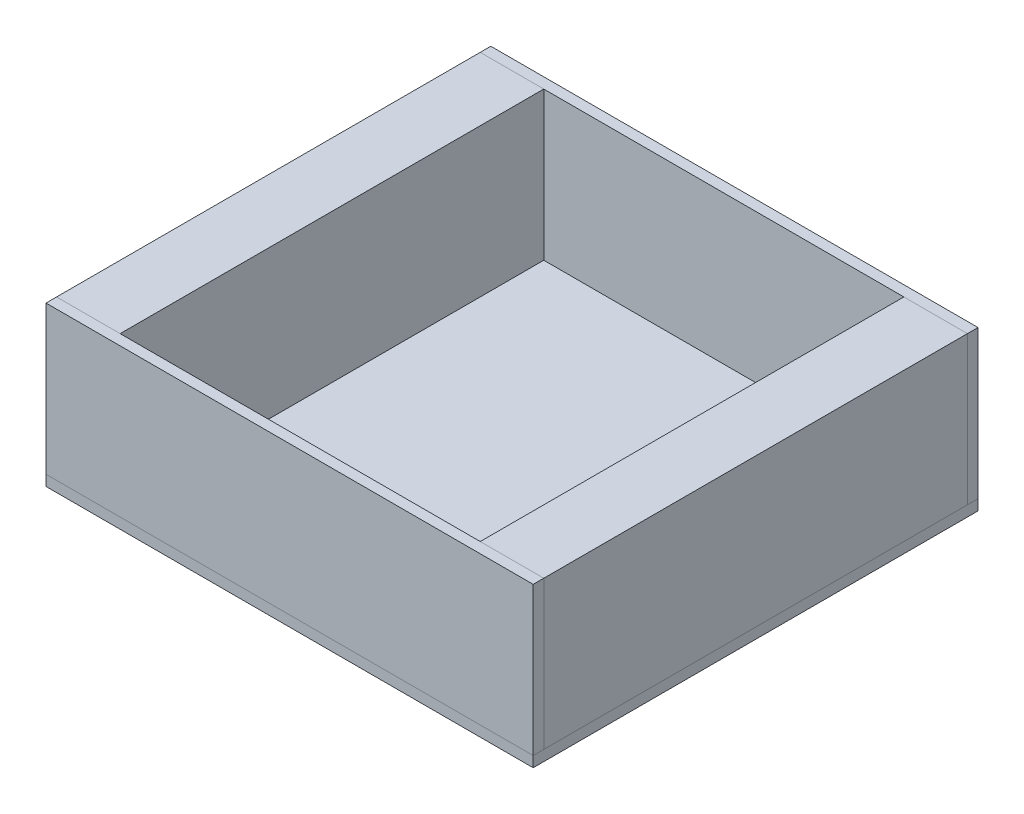
ISO-10303-21;
HEADER;
FILE_DESCRIPTION(('STEP AP214'),'2;1');
FILE_NAME('part.step','',(''),(''),'','','');
FILE_SCHEMA(('AUTOMOTIVE_DESIGN { 1 0 10303 214 1 1 1 1 }'));
ENDSEC;
DATA;
#1=APPLICATION_CONTEXT('core data for automotive mechanical design processes');
#2=APPLICATION_PROTOCOL_DEFINITION('international standard','automotive_design',2000,#1);
#3=PRODUCT_CONTEXT('',#1,'mechanical');
#4=PRODUCT('Part','Part','',(#3));
#5=PRODUCT_RELATED_PRODUCT_CATEGORY('part','',(#4));
#6=PRODUCT_DEFINITION_FORMATION('','',#4);
#7=PRODUCT_DEFINITION_CONTEXT('part definition',#1,'design');
#8=PRODUCT_DEFINITION('design','',#6,#7);
#9=PRODUCT_DEFINITION_SHAPE('','',#8);
#10=(LENGTH_UNIT() NAMED_UNIT(*) SI_UNIT(.MILLI.,.METRE.));
#11=(NAMED_UNIT(*) PLANE_ANGLE_UNIT() SI_UNIT($,.RADIAN.));
#12=(NAMED_UNIT(*) SI_UNIT($,.STERADIAN.) SOLID_ANGLE_UNIT());
#13=UNCERTAINTY_MEASURE_WITH_UNIT(LENGTH_MEASURE(1.E-05),#10,'distance_accuracy_value','');
#14=(GEOMETRIC_REPRESENTATION_CONTEXT(3) GLOBAL_UNCERTAINTY_ASSIGNED_CONTEXT((#13)) GLOBAL_UNIT_ASSIGNED_CONTEXT((#10,
#11,#12)) REPRESENTATION_CONTEXT('',''));
#15=CARTESIAN_POINT('',(0.,0.,0.));
#16=DIRECTION('',(0.,0.,1.));
#17=DIRECTION('',(1.,0.,0.));
#18=AXIS2_PLACEMENT_3D('',#15,#16,#17);
#19=CARTESIAN_POINT('',(-19.05,-50.8,-6.35000000000002));
#20=DIRECTION('',(0.,0.,-1.));
#21=DIRECTION('',(-1.,0.,0.));
#22=AXIS2_PLACEMENT_3D('',#19,#20,#21);
#23=PLANE('',#22);
#24=DIRECTION('',(-1.,0.,0.));
#25=VECTOR('',#24,1.);
#26=CARTESIAN_POINT('',(-19.05,-44.45,-6.35000000000002));
#27=LINE('',#26,#25);
#28=CARTESIAN_POINT('',(273.05,-44.45,-6.35000000000002));
#29=VERTEX_POINT('',#28);
#30=CARTESIAN_POINT('',(-19.05,-44.45,-6.35000000000002));
#31=VERTEX_POINT('',#30);
#32=EDGE_CURVE('E117',#29,#31,#27,.T.);
#33=ORIENTED_EDGE('',*,*,#32,.F.);
#34=DIRECTION('',(0.,1.,0.));
#35=VECTOR('',#34,1.);
#36=CARTESIAN_POINT('',(273.05,-50.8,-6.35000000000002));
#37=LINE('',#36,#35);
#38=CARTESIAN_POINT('',(273.05,-50.8,-6.35000000000002));
#39=VERTEX_POINT('',#38);
#40=EDGE_CURVE('E12',#39,#29,#37,.T.);
#41=ORIENTED_EDGE('',*,*,#40,.F.);
#42=DIRECTION('',(-1.,0.,0.));
#43=VECTOR('',#42,1.);
#44=CARTESIAN_POINT('',(-19.05,-50.8,-6.35000000000002));
#45=LINE('',#44,#43);
#46=CARTESIAN_POINT('',(-19.05,-50.8,-6.35000000000002));
#47=VERTEX_POINT('',#46);
#48=EDGE_CURVE('E111',#39,#47,#45,.T.);
#49=ORIENTED_EDGE('',*,*,#48,.T.);
#50=DIRECTION('',(0.,1.,0.));
#51=VECTOR('',#50,1.);
#52=CARTESIAN_POINT('',(-19.05,-50.8,-6.35000000000002));
#53=LINE('',#52,#51);
#54=EDGE_CURVE('E56',#47,#31,#53,.T.);
#55=ORIENTED_EDGE('',*,*,#54,.T.);
#56=EDGE_LOOP('',(#33,#41,#49,#55));
#57=FACE_BOUND('',#56,.T.);
#58=ADVANCED_FACE('F53',(#57),#23,.T.);
#59=CARTESIAN_POINT('',(273.05,-50.8,254.));
#60=DIRECTION('',(1.,0.,0.));
#61=DIRECTION('',(0.,0.,-1.));
#62=AXIS2_PLACEMENT_3D('',#59,#60,#61);
#63=PLANE('',#62);
#64=DIRECTION('',(0.,0.,-1.));
#65=VECTOR('',#64,1.);
#66=CARTESIAN_POINT('',(273.05,-44.45,254.));
#67=LINE('',#66,#65);
#68=CARTESIAN_POINT('',(273.05,-44.45,260.35));
#69=VERTEX_POINT('',#68);
#70=EDGE_CURVE('E113',#69,#29,#67,.T.);
#71=ORIENTED_EDGE('',*,*,#70,.F.);
#72=DIRECTION('',(0.,1.,0.));
#73=VECTOR('',#72,1.);
#74=CARTESIAN_POINT('',(273.05,-50.8,260.35));
#75=LINE('',#74,#73);
#76=CARTESIAN_POINT('',(273.05,-50.8,260.35));
#77=VERTEX_POINT('',#76);
#78=EDGE_CURVE('E62',#77,#69,#75,.T.);
#79=ORIENTED_EDGE('',*,*,#78,.F.);
#80=DIRECTION('',(0.,0.,-1.));
#81=VECTOR('',#80,1.);
#82=CARTESIAN_POINT('',(273.05,-50.8,254.));
#83=LINE('',#82,#81);
#84=EDGE_CURVE('E108',#77,#39,#83,.T.);
#85=ORIENTED_EDGE('',*,*,#84,.T.);
#86=ORIENTED_EDGE('',*,*,#40,.T.);
#87=EDGE_LOOP('',(#71,#79,#85,#86));
#88=FACE_BOUND('',#87,.T.);
#89=ADVANCED_FACE('F127',(#88),#63,.T.);
#90=CARTESIAN_POINT('',(-19.05,-50.8,260.35));
#91=DIRECTION('',(0.,0.,1.));
#92=DIRECTION('',(1.,0.,0.));
#93=AXIS2_PLACEMENT_3D('',#90,#91,#92);
#94=PLANE('',#93);
#95=DIRECTION('',(1.,0.,0.));
#96=VECTOR('',#95,1.);
#97=CARTESIAN_POINT('',(-19.05,-44.45,260.35));
#98=LINE('',#97,#96);
#99=CARTESIAN_POINT('',(-19.05,-44.45,260.35));
#100=VERTEX_POINT('',#99);
#101=EDGE_CURVE('E103',#100,#69,#98,.T.);
#102=ORIENTED_EDGE('',*,*,#101,.F.);
#103=DIRECTION('',(0.,1.,0.));
#104=VECTOR('',#103,1.);
#105=CARTESIAN_POINT('',(-19.05,-50.8,260.35));
#106=LINE('',#105,#104);
#107=CARTESIAN_POINT('',(-19.05,-50.8,260.35));
#108=VERTEX_POINT('',#107);
#109=EDGE_CURVE('E98',#108,#100,#106,.T.);
#110=ORIENTED_EDGE('',*,*,#109,.F.);
#111=DIRECTION('',(1.,0.,0.));
#112=VECTOR('',#111,1.);
#113=CARTESIAN_POINT('',(-19.05,-50.8,260.35));
#114=LINE('',#113,#112);
#115=EDGE_CURVE('E101',#108,#77,#114,.T.);
#116=ORIENTED_EDGE('',*,*,#115,.T.);
#117=ORIENTED_EDGE('',*,*,#78,.T.);
#118=EDGE_LOOP('',(#102,#110,#116,#117));
#119=FACE_BOUND('',#118,.T.);
#120=ADVANCED_FACE('F100',(#119),#94,.T.);
#121=CARTESIAN_POINT('',(-19.05,-50.8,254.));
#122=DIRECTION('',(-1.,0.,0.));
#123=DIRECTION('',(0.,0.,1.));
#124=AXIS2_PLACEMENT_3D('',#121,#122,#123);
#125=PLANE('',#124);
#126=DIRECTION('',(0.,0.,1.));
#127=VECTOR('',#126,1.);
#128=CARTESIAN_POINT('',(-19.05,-44.45,254.));
#129=LINE('',#128,#127);
#130=EDGE_CURVE('E120',#31,#100,#129,.T.);
#131=ORIENTED_EDGE('',*,*,#130,.F.);
#132=ORIENTED_EDGE('',*,*,#54,.F.);
#133=DIRECTION('',(0.,0.,1.));
#134=VECTOR('',#133,1.);
#135=CARTESIAN_POINT('',(-19.05,-50.8,254.));
#136=LINE('',#135,#134);
#137=EDGE_CURVE('E107',#47,#108,#136,.T.);
#138=ORIENTED_EDGE('',*,*,#137,.T.);
#139=ORIENTED_EDGE('',*,*,#109,.T.);
#140=EDGE_LOOP('',(#131,#132,#138,#139));
#141=FACE_BOUND('',#140,.T.);
#142=ADVANCED_FACE('F110',(#141),#125,.T.);
#143=CARTESIAN_POINT('',(0.,-50.8,0.));
#144=DIRECTION('',(0.,1.,0.));
#145=DIRECTION('',(0.,0.,1.));
#146=AXIS2_PLACEMENT_3D('',#143,#144,#145);
#147=PLANE('',#146);
#148=ORIENTED_EDGE('',*,*,#48,.F.);
#149=ORIENTED_EDGE('',*,*,#84,.F.);
#150=ORIENTED_EDGE('',*,*,#115,.F.);
#151=ORIENTED_EDGE('',*,*,#137,.F.);
#152=EDGE_LOOP('',(#148,#149,#150,#151));
#153=FACE_BOUND('',#152,.T.);
#154=ADVANCED_FACE('F106',(#153),#147,.F.);
#155=CARTESIAN_POINT('',(0.,-44.45,0.));
#156=DIRECTION('',(0.,1.,0.));
#157=DIRECTION('',(0.,0.,1.));
#158=AXIS2_PLACEMENT_3D('',#155,#156,#157);
#159=PLANE('',#158);
#160=ORIENTED_EDGE('',*,*,#32,.T.);
#161=ORIENTED_EDGE('',*,*,#130,.T.);
#162=ORIENTED_EDGE('',*,*,#101,.T.);
#163=ORIENTED_EDGE('',*,*,#70,.T.);
#164=EDGE_LOOP('',(#160,#161,#162,#163));
#165=FACE_BOUND('',#164,.T.);
#166=ADVANCED_FACE('F126',(#165),#159,.T.);
#167=CLOSED_SHELL('',(#58,#89,#120,#142,#154,#166));
#168=MANIFOLD_SOLID_BREP('B2',#167);
#169=CARTESIAN_POINT('',(0.,44.45,260.35));
#170=DIRECTION('',(0.,-1.,0.));
#171=DIRECTION('',(0.,0.,-1.));
#172=AXIS2_PLACEMENT_3D('',#169,#170,#171);
#173=PLANE('',#172);
#174=DIRECTION('',(-1.,0.,0.));
#175=VECTOR('',#174,1.);
#176=CARTESIAN_POINT('',(0.,44.45,254.));
#177=LINE('',#176,#175);
#178=CARTESIAN_POINT('',(273.05,44.45,254.));
#179=VERTEX_POINT('',#178);
#180=CARTESIAN_POINT('',(-19.05,44.45,254.));
#181=VERTEX_POINT('',#180);
#182=EDGE_CURVE('E249',#179,#181,#177,.T.);
#183=ORIENTED_EDGE('',*,*,#182,.T.);
#184=DIRECTION('',(0.,0.,-1.));
#185=VECTOR('',#184,1.);
#186=CARTESIAN_POINT('',(-19.05,44.45,260.35));
#187=LINE('',#186,#185);
#188=CARTESIAN_POINT('',(-19.05,44.45,260.35));
#189=VERTEX_POINT('',#188);
#190=EDGE_CURVE('E51',#189,#181,#187,.T.);
#191=ORIENTED_EDGE('',*,*,#190,.F.);
#192=DIRECTION('',(-1.,0.,0.));
#193=VECTOR('',#192,1.);
#194=CARTESIAN_POINT('',(0.,44.45,260.35));
#195=LINE('',#194,#193);
#196=CARTESIAN_POINT('',(273.05,44.45,260.35));
#197=VERTEX_POINT('',#196);
#198=EDGE_CURVE('E237',#197,#189,#195,.T.);
#199=ORIENTED_EDGE('',*,*,#198,.F.);
#200=DIRECTION('',(0.,0.,-1.));
#201=VECTOR('',#200,1.);
#202=CARTESIAN_POINT('',(273.05,44.45,260.35));
#203=LINE('',#202,#201);
#204=EDGE_CURVE('E245',#197,#179,#203,.T.);
#205=ORIENTED_EDGE('',*,*,#204,.T.);
#206=EDGE_LOOP('',(#183,#191,#199,#205));
#207=FACE_BOUND('',#206,.T.);
#208=ADVANCED_FACE('F186',(#207),#173,.F.);
#209=CARTESIAN_POINT('',(-19.05,0.,260.35));
#210=DIRECTION('',(1.,0.,0.));
#211=DIRECTION('',(0.,0.,-1.));
#212=AXIS2_PLACEMENT_3D('',#209,#210,#211);
#213=PLANE('',#212);
#214=DIRECTION('',(0.,-1.,0.));
#215=VECTOR('',#214,1.);
#216=CARTESIAN_POINT('',(-19.05,0.,254.));
#217=LINE('',#216,#215);
#218=CARTESIAN_POINT('',(-19.05,-44.45,254.));
#219=VERTEX_POINT('',#218);
#220=EDGE_CURVE('E241',#181,#219,#217,.T.);
#221=ORIENTED_EDGE('',*,*,#220,.T.);
#222=DIRECTION('',(0.,0.,-1.));
#223=VECTOR('',#222,1.);
#224=CARTESIAN_POINT('',(-19.05,-44.45,260.35));
#225=LINE('',#224,#223);
#226=CARTESIAN_POINT('',(-19.05,-44.45,260.35));
#227=VERTEX_POINT('',#226);
#228=EDGE_CURVE('E194',#227,#219,#225,.T.);
#229=ORIENTED_EDGE('',*,*,#228,.F.);
#230=DIRECTION('',(0.,-1.,0.));
#231=VECTOR('',#230,1.);
#232=CARTESIAN_POINT('',(-19.05,0.,260.35));
#233=LINE('',#232,#231);
#234=EDGE_CURVE('E232',#189,#227,#233,.T.);
#235=ORIENTED_EDGE('',*,*,#234,.F.);
#236=ORIENTED_EDGE('',*,*,#190,.T.);
#237=EDGE_LOOP('',(#221,#229,#235,#236));
#238=FACE_BOUND('',#237,.T.);
#239=ADVANCED_FACE('F240',(#238),#213,.F.);
#240=CARTESIAN_POINT('',(0.,-44.45,260.35));
#241=DIRECTION('',(0.,1.,0.));
#242=DIRECTION('',(0.,0.,1.));
#243=AXIS2_PLACEMENT_3D('',#240,#241,#242);
#244=PLANE('',#243);
#245=DIRECTION('',(1.,0.,0.));
#246=VECTOR('',#245,1.);
#247=CARTESIAN_POINT('',(0.,-44.45,254.));
#248=LINE('',#247,#246);
#249=CARTESIAN_POINT('',(273.05,-44.45,254.));
#250=VERTEX_POINT('',#249);
#251=EDGE_CURVE('E219',#219,#250,#248,.T.);
#252=ORIENTED_EDGE('',*,*,#251,.T.);
#253=DIRECTION('',(0.,0.,-1.));
#254=VECTOR('',#253,1.);
#255=CARTESIAN_POINT('',(273.05,-44.45,260.35));
#256=LINE('',#255,#254);
#257=CARTESIAN_POINT('',(273.05,-44.45,260.35));
#258=VERTEX_POINT('',#257);
#259=EDGE_CURVE('E242',#258,#250,#256,.T.);
#260=ORIENTED_EDGE('',*,*,#259,.F.);
#261=DIRECTION('',(1.,0.,0.));
#262=VECTOR('',#261,1.);
#263=CARTESIAN_POINT('',(0.,-44.45,260.35));
#264=LINE('',#263,#262);
#265=EDGE_CURVE('E235',#227,#258,#264,.T.);
#266=ORIENTED_EDGE('',*,*,#265,.F.);
#267=ORIENTED_EDGE('',*,*,#228,.T.);
#268=EDGE_LOOP('',(#252,#260,#266,#267));
#269=FACE_BOUND('',#268,.T.);
#270=ADVANCED_FACE('F243',(#269),#244,.F.);
#271=CARTESIAN_POINT('',(273.05,0.,260.35));
#272=DIRECTION('',(-1.,0.,0.));
#273=DIRECTION('',(0.,0.,1.));
#274=AXIS2_PLACEMENT_3D('',#271,#272,#273);
#275=PLANE('',#274);
#276=DIRECTION('',(0.,1.,0.));
#277=VECTOR('',#276,1.);
#278=CARTESIAN_POINT('',(273.05,0.,254.));
#279=LINE('',#278,#277);
#280=EDGE_CURVE('E225',#250,#179,#279,.T.);
#281=ORIENTED_EDGE('',*,*,#280,.T.);
#282=ORIENTED_EDGE('',*,*,#204,.F.);
#283=DIRECTION('',(0.,1.,0.));
#284=VECTOR('',#283,1.);
#285=CARTESIAN_POINT('',(273.05,0.,260.35));
#286=LINE('',#285,#284);
#287=EDGE_CURVE('E202',#258,#197,#286,.T.);
#288=ORIENTED_EDGE('',*,*,#287,.F.);
#289=ORIENTED_EDGE('',*,*,#259,.T.);
#290=EDGE_LOOP('',(#281,#282,#288,#289));
#291=FACE_BOUND('',#290,.T.);
#292=ADVANCED_FACE('F256',(#291),#275,.F.);
#293=CARTESIAN_POINT('',(0.,0.,260.35));
#294=DIRECTION('',(0.,0.,1.));
#295=DIRECTION('',(1.,0.,0.));
#296=AXIS2_PLACEMENT_3D('',#293,#294,#295);
#297=PLANE('',#296);
#298=ORIENTED_EDGE('',*,*,#198,.T.);
#299=ORIENTED_EDGE('',*,*,#234,.T.);
#300=ORIENTED_EDGE('',*,*,#265,.T.);
#301=ORIENTED_EDGE('',*,*,#287,.T.);
#302=EDGE_LOOP('',(#298,#299,#300,#301));
#303=FACE_BOUND('',#302,.T.);
#304=ADVANCED_FACE('F233',(#303),#297,.T.);
#305=CARTESIAN_POINT('',(0.,0.,254.));
#306=DIRECTION('',(0.,0.,1.));
#307=DIRECTION('',(1.,0.,0.));
#308=AXIS2_PLACEMENT_3D('',#305,#306,#307);
#309=PLANE('',#308);
#310=ORIENTED_EDGE('',*,*,#182,.F.);
#311=ORIENTED_EDGE('',*,*,#280,.F.);
#312=ORIENTED_EDGE('',*,*,#251,.F.);
#313=ORIENTED_EDGE('',*,*,#220,.F.);
#314=EDGE_LOOP('',(#310,#311,#312,#313));
#315=FACE_BOUND('',#314,.T.);
#316=ADVANCED_FACE('F259',(#315),#309,.F.);
#317=CLOSED_SHELL('',(#208,#239,#270,#292,#304,#316));
#318=MANIFOLD_SOLID_BREP('B6',#317);
#319=CARTESIAN_POINT('',(-19.05,-44.45,-6.35));
#320=DIRECTION('',(-1.,0.,0.));
#321=DIRECTION('',(0.,0.,1.));
#322=AXIS2_PLACEMENT_3D('',#319,#320,#321);
#323=PLANE('',#322);
#324=DIRECTION('',(0.,-1.,0.));
#325=VECTOR('',#324,1.);
#326=CARTESIAN_POINT('',(-19.05,-44.45,0.));
#327=LINE('',#326,#325);
#328=CARTESIAN_POINT('',(-19.05,44.45,0.));
#329=VERTEX_POINT('',#328);
#330=CARTESIAN_POINT('',(-19.05,-44.45,0.));
#331=VERTEX_POINT('',#330);
#332=EDGE_CURVE('E383',#329,#331,#327,.T.);
#333=ORIENTED_EDGE('',*,*,#332,.F.);
#334=DIRECTION('',(0.,0.,1.));
#335=VECTOR('',#334,1.);
#336=CARTESIAN_POINT('',(-19.05,44.45,-6.35));
#337=LINE('',#336,#335);
#338=CARTESIAN_POINT('',(-19.05,44.45,-6.35));
#339=VERTEX_POINT('',#338);
#340=EDGE_CURVE('E184',#339,#329,#337,.T.);
#341=ORIENTED_EDGE('',*,*,#340,.F.);
#342=DIRECTION('',(0.,-1.,0.));
#343=VECTOR('',#342,1.);
#344=CARTESIAN_POINT('',(-19.05,-44.45,-6.35));
#345=LINE('',#344,#343);
#346=CARTESIAN_POINT('',(-19.05,-44.45,-6.35));
#347=VERTEX_POINT('',#346);
#348=EDGE_CURVE('E377',#339,#347,#345,.T.);
#349=ORIENTED_EDGE('',*,*,#348,.T.);
#350=DIRECTION('',(0.,0.,1.));
#351=VECTOR('',#350,1.);
#352=CARTESIAN_POINT('',(-19.05,-44.45,-6.35));
#353=LINE('',#352,#351);
#354=EDGE_CURVE('E322',#347,#331,#353,.T.);
#355=ORIENTED_EDGE('',*,*,#354,.T.);
#356=EDGE_LOOP('',(#333,#341,#349,#355));
#357=FACE_BOUND('',#356,.T.);
#358=ADVANCED_FACE('F319',(#357),#323,.T.);
#359=CARTESIAN_POINT('',(-19.05,44.45,-6.35));
#360=DIRECTION('',(0.,1.,0.));
#361=DIRECTION('',(0.,0.,1.));
#362=AXIS2_PLACEMENT_3D('',#359,#360,#361);
#363=PLANE('',#362);
#364=DIRECTION('',(-1.,0.,0.));
#365=VECTOR('',#364,1.);
#366=CARTESIAN_POINT('',(-19.05,44.45,0.));
#367=LINE('',#366,#365);
#368=CARTESIAN_POINT('',(273.05,44.45,0.));
#369=VERTEX_POINT('',#368);
#370=EDGE_CURVE('E379',#369,#329,#367,.T.);
#371=ORIENTED_EDGE('',*,*,#370,.F.);
#372=DIRECTION('',(0.,0.,1.));
#373=VECTOR('',#372,1.);
#374=CARTESIAN_POINT('',(273.05,44.45,-6.35));
#375=LINE('',#374,#373);
#376=CARTESIAN_POINT('',(273.05,44.45,-6.35));
#377=VERTEX_POINT('',#376);
#378=EDGE_CURVE('E328',#377,#369,#375,.T.);
#379=ORIENTED_EDGE('',*,*,#378,.F.);
#380=DIRECTION('',(-1.,0.,0.));
#381=VECTOR('',#380,1.);
#382=CARTESIAN_POINT('',(-19.05,44.45,-6.35));
#383=LINE('',#382,#381);
#384=EDGE_CURVE('E374',#377,#339,#383,.T.);
#385=ORIENTED_EDGE('',*,*,#384,.T.);
#386=ORIENTED_EDGE('',*,*,#340,.T.);
#387=EDGE_LOOP('',(#371,#379,#385,#386));
#388=FACE_BOUND('',#387,.T.);
#389=ADVANCED_FACE('F393',(#388),#363,.T.);
#390=CARTESIAN_POINT('',(273.05,-44.45,-6.35));
#391=DIRECTION('',(1.,0.,0.));
#392=DIRECTION('',(0.,0.,-1.));
#393=AXIS2_PLACEMENT_3D('',#390,#391,#392);
#394=PLANE('',#393);
#395=DIRECTION('',(0.,1.,0.));
#396=VECTOR('',#395,1.);
#397=CARTESIAN_POINT('',(273.05,-44.45,0.));
#398=LINE('',#397,#396);
#399=CARTESIAN_POINT('',(273.05,-44.45,0.));
#400=VERTEX_POINT('',#399);
#401=EDGE_CURVE('E369',#400,#369,#398,.T.);
#402=ORIENTED_EDGE('',*,*,#401,.F.);
#403=DIRECTION('',(0.,0.,1.));
#404=VECTOR('',#403,1.);
#405=CARTESIAN_POINT('',(273.05,-44.45,-6.35));
#406=LINE('',#405,#404);
#407=CARTESIAN_POINT('',(273.05,-44.45,-6.35));
#408=VERTEX_POINT('',#407);
#409=EDGE_CURVE('E364',#408,#400,#406,.T.);
#410=ORIENTED_EDGE('',*,*,#409,.F.);
#411=DIRECTION('',(0.,1.,0.));
#412=VECTOR('',#411,1.);
#413=CARTESIAN_POINT('',(273.05,-44.45,-6.35));
#414=LINE('',#413,#412);
#415=EDGE_CURVE('E367',#408,#377,#414,.T.);
#416=ORIENTED_EDGE('',*,*,#415,.T.);
#417=ORIENTED_EDGE('',*,*,#378,.T.);
#418=EDGE_LOOP('',(#402,#410,#416,#417));
#419=FACE_BOUND('',#418,.T.);
#420=ADVANCED_FACE('F366',(#419),#394,.T.);
#421=CARTESIAN_POINT('',(-19.05,-44.45,-6.35));
#422=DIRECTION('',(0.,-1.,0.));
#423=DIRECTION('',(0.,0.,-1.));
#424=AXIS2_PLACEMENT_3D('',#421,#422,#423);
#425=PLANE('',#424);
#426=DIRECTION('',(1.,0.,0.));
#427=VECTOR('',#426,1.);
#428=CARTESIAN_POINT('',(-19.05,-44.45,0.));
#429=LINE('',#428,#427);
#430=EDGE_CURVE('E386',#331,#400,#429,.T.);
#431=ORIENTED_EDGE('',*,*,#430,.F.);
#432=ORIENTED_EDGE('',*,*,#354,.F.);
#433=DIRECTION('',(1.,0.,0.));
#434=VECTOR('',#433,1.);
#435=CARTESIAN_POINT('',(-19.05,-44.45,-6.35));
#436=LINE('',#435,#434);
#437=EDGE_CURVE('E373',#347,#408,#436,.T.);
#438=ORIENTED_EDGE('',*,*,#437,.T.);
#439=ORIENTED_EDGE('',*,*,#409,.T.);
#440=EDGE_LOOP('',(#431,#432,#438,#439));
#441=FACE_BOUND('',#440,.T.);
#442=ADVANCED_FACE('F376',(#441),#425,.T.);
#443=CARTESIAN_POINT('',(0.,0.,-6.35));
#444=DIRECTION('',(0.,0.,-1.));
#445=DIRECTION('',(-1.,0.,0.));
#446=AXIS2_PLACEMENT_3D('',#443,#444,#445);
#447=PLANE('',#446);
#448=ORIENTED_EDGE('',*,*,#348,.F.);
#449=ORIENTED_EDGE('',*,*,#384,.F.);
#450=ORIENTED_EDGE('',*,*,#415,.F.);
#451=ORIENTED_EDGE('',*,*,#437,.F.);
#452=EDGE_LOOP('',(#448,#449,#450,#451));
#453=FACE_BOUND('',#452,.T.);
#454=ADVANCED_FACE('F372',(#453),#447,.T.);
#455=CARTESIAN_POINT('',(0.,0.,0.));
#456=DIRECTION('',(0.,0.,-1.));
#457=DIRECTION('',(-1.,0.,0.));
#458=AXIS2_PLACEMENT_3D('',#455,#456,#457);
#459=PLANE('',#458);
#460=ORIENTED_EDGE('',*,*,#332,.T.);
#461=ORIENTED_EDGE('',*,*,#430,.T.);
#462=ORIENTED_EDGE('',*,*,#401,.T.);
#463=ORIENTED_EDGE('',*,*,#370,.T.);
#464=EDGE_LOOP('',(#460,#461,#462,#463));
#465=FACE_BOUND('',#464,.T.);
#466=ADVANCED_FACE('F392',(#465),#459,.F.);
#467=CLOSED_SHELL('',(#358,#389,#420,#442,#454,#466));
#468=MANIFOLD_SOLID_BREP('B45',#467);
#469=CARTESIAN_POINT('',(273.05,-44.45,254.));
#470=DIRECTION('',(-1.,0.,0.));
#471=DIRECTION('',(0.,0.,1.));
#472=AXIS2_PLACEMENT_3D('',#469,#470,#471);
#473=PLANE('',#472);
#474=DIRECTION('',(0.,1.,0.));
#475=VECTOR('',#474,1.);
#476=CARTESIAN_POINT('',(273.05,-44.45,0.));
#477=LINE('',#476,#475);
#478=CARTESIAN_POINT('',(273.05,-44.45,0.));
#479=VERTEX_POINT('',#478);
#480=CARTESIAN_POINT('',(273.05,44.45,0.));
#481=VERTEX_POINT('',#480);
#482=EDGE_CURVE('E317',#479,#481,#477,.T.);
#483=ORIENTED_EDGE('',*,*,#482,.T.);
#484=DIRECTION('',(0.,0.,-1.));
#485=VECTOR('',#484,1.);
#486=CARTESIAN_POINT('',(273.05,44.45,254.));
#487=LINE('',#486,#485);
#488=CARTESIAN_POINT('',(273.05,44.45,254.));
#489=VERTEX_POINT('',#488);
#490=EDGE_CURVE('E522',#489,#481,#487,.T.);
#491=ORIENTED_EDGE('',*,*,#490,.F.);
#492=DIRECTION('',(0.,1.,0.));
#493=VECTOR('',#492,1.);
#494=CARTESIAN_POINT('',(273.05,-44.45,254.));
#495=LINE('',#494,#493);
#496=CARTESIAN_POINT('',(273.05,-44.45,254.));
#497=VERTEX_POINT('',#496);
#498=EDGE_CURVE('E455',#497,#489,#495,.T.);
#499=ORIENTED_EDGE('',*,*,#498,.F.);
#500=DIRECTION('',(0.,0.,-1.));
#501=VECTOR('',#500,1.);
#502=CARTESIAN_POINT('',(273.05,-44.45,254.));
#503=LINE('',#502,#501);
#504=EDGE_CURVE('E510',#497,#479,#503,.T.);
#505=ORIENTED_EDGE('',*,*,#504,.T.);
#506=EDGE_LOOP('',(#483,#491,#499,#505));
#507=FACE_BOUND('',#506,.T.);
#508=ADVANCED_FACE('F451',(#507),#473,.F.);
#509=CARTESIAN_POINT('',(234.95,44.45,254.));
#510=DIRECTION('',(0.,-1.,0.));
#511=DIRECTION('',(0.,0.,-1.));
#512=AXIS2_PLACEMENT_3D('',#509,#510,#511);
#513=PLANE('',#512);
#514=DIRECTION('',(-1.,0.,0.));
#515=VECTOR('',#514,1.);
#516=CARTESIAN_POINT('',(234.95,44.45,0.));
#517=LINE('',#516,#515);
#518=CARTESIAN_POINT('',(234.95,44.45,0.));
#519=VERTEX_POINT('',#518);
#520=EDGE_CURVE('E461',#481,#519,#517,.T.);
#521=ORIENTED_EDGE('',*,*,#520,.T.);
#522=DIRECTION('',(0.,0.,-1.));
#523=VECTOR('',#522,1.);
#524=CARTESIAN_POINT('',(234.95,44.45,254.));
#525=LINE('',#524,#523);
#526=CARTESIAN_POINT('',(234.95,44.45,254.));
#527=VERTEX_POINT('',#526);
#528=EDGE_CURVE('E506',#527,#519,#525,.T.);
#529=ORIENTED_EDGE('',*,*,#528,.F.);
#530=DIRECTION('',(-1.,0.,0.));
#531=VECTOR('',#530,1.);
#532=CARTESIAN_POINT('',(234.95,44.45,254.));
#533=LINE('',#532,#531);
#534=EDGE_CURVE('E485',#489,#527,#533,.T.);
#535=ORIENTED_EDGE('',*,*,#534,.F.);
#536=ORIENTED_EDGE('',*,*,#490,.T.);
#537=EDGE_LOOP('',(#521,#529,#535,#536));
#538=FACE_BOUND('',#537,.T.);
#539=ADVANCED_FACE('F525',(#538),#513,.F.);
#540=CARTESIAN_POINT('',(234.95,-44.45,254.));
#541=DIRECTION('',(1.,0.,0.));
#542=DIRECTION('',(0.,0.,-1.));
#543=AXIS2_PLACEMENT_3D('',#540,#541,#542);
#544=PLANE('',#543);
#545=DIRECTION('',(0.,-1.,0.));
#546=VECTOR('',#545,1.);
#547=CARTESIAN_POINT('',(234.95,-44.45,0.));
#548=LINE('',#547,#546);
#549=CARTESIAN_POINT('',(234.95,-44.45,0.));
#550=VERTEX_POINT('',#549);
#551=EDGE_CURVE('E501',#519,#550,#548,.T.);
#552=ORIENTED_EDGE('',*,*,#551,.T.);
#553=DIRECTION('',(0.,0.,-1.));
#554=VECTOR('',#553,1.);
#555=CARTESIAN_POINT('',(234.95,-44.45,254.));
#556=LINE('',#555,#554);
#557=CARTESIAN_POINT('',(234.95,-44.45,254.));
#558=VERTEX_POINT('',#557);
#559=EDGE_CURVE('E504',#558,#550,#556,.T.);
#560=ORIENTED_EDGE('',*,*,#559,.F.);
#561=DIRECTION('',(0.,-1.,0.));
#562=VECTOR('',#561,1.);
#563=CARTESIAN_POINT('',(234.95,-44.45,254.));
#564=LINE('',#563,#562);
#565=EDGE_CURVE('E518',#527,#558,#564,.T.);
#566=ORIENTED_EDGE('',*,*,#565,.F.);
#567=ORIENTED_EDGE('',*,*,#528,.T.);
#568=EDGE_LOOP('',(#552,#560,#566,#567));
#569=FACE_BOUND('',#568,.T.);
#570=ADVANCED_FACE('F502',(#569),#544,.F.);
#571=CARTESIAN_POINT('',(234.95,-44.45,254.));
#572=DIRECTION('',(0.,1.,0.));
#573=DIRECTION('',(0.,0.,1.));
#574=AXIS2_PLACEMENT_3D('',#571,#572,#573);
#575=PLANE('',#574);
#576=DIRECTION('',(1.,0.,0.));
#577=VECTOR('',#576,1.);
#578=CARTESIAN_POINT('',(234.95,-44.45,0.));
#579=LINE('',#578,#577);
#580=EDGE_CURVE('E495',#550,#479,#579,.T.);
#581=ORIENTED_EDGE('',*,*,#580,.T.);
#582=ORIENTED_EDGE('',*,*,#504,.F.);
#583=DIRECTION('',(1.,0.,0.));
#584=VECTOR('',#583,1.);
#585=CARTESIAN_POINT('',(234.95,-44.45,254.));
#586=LINE('',#585,#584);
#587=EDGE_CURVE('E509',#558,#497,#586,.T.);
#588=ORIENTED_EDGE('',*,*,#587,.F.);
#589=ORIENTED_EDGE('',*,*,#559,.T.);
#590=EDGE_LOOP('',(#581,#582,#588,#589));
#591=FACE_BOUND('',#590,.T.);
#592=ADVANCED_FACE('F508',(#591),#575,.F.);
#593=CARTESIAN_POINT('',(0.,0.,254.));
#594=DIRECTION('',(0.,0.,-1.));
#595=DIRECTION('',(-1.,0.,0.));
#596=AXIS2_PLACEMENT_3D('',#593,#594,#595);
#597=PLANE('',#596);
#598=ORIENTED_EDGE('',*,*,#498,.T.);
#599=ORIENTED_EDGE('',*,*,#534,.T.);
#600=ORIENTED_EDGE('',*,*,#565,.T.);
#601=ORIENTED_EDGE('',*,*,#587,.T.);
#602=EDGE_LOOP('',(#598,#599,#600,#601));
#603=FACE_BOUND('',#602,.T.);
#604=ADVANCED_FACE('F453',(#603),#597,.F.);
#605=CARTESIAN_POINT('',(0.,0.,0.));
#606=DIRECTION('',(0.,0.,-1.));
#607=DIRECTION('',(-1.,0.,0.));
#608=AXIS2_PLACEMENT_3D('',#605,#606,#607);
#609=PLANE('',#608);
#610=ORIENTED_EDGE('',*,*,#482,.F.);
#611=ORIENTED_EDGE('',*,*,#580,.F.);
#612=ORIENTED_EDGE('',*,*,#551,.F.);
#613=ORIENTED_EDGE('',*,*,#520,.F.);
#614=EDGE_LOOP('',(#610,#611,#612,#613));
#615=FACE_BOUND('',#614,.T.);
#616=ADVANCED_FACE('F512',(#615),#609,.T.);
#617=CLOSED_SHELL('',(#508,#539,#570,#592,#604,#616));
#618=MANIFOLD_SOLID_BREP('B178',#617);
#619=CARTESIAN_POINT('',(19.05,-44.45,254.));
#620=DIRECTION('',(-1.,0.,0.));
#621=DIRECTION('',(0.,-1.,0.));
#622=AXIS2_PLACEMENT_3D('',#619,#620,#621);
#623=PLANE('',#622);
#624=DIRECTION('',(0.,1.,0.));
#625=VECTOR('',#624,1.);
#626=CARTESIAN_POINT('',(19.05,-44.45,0.));
#627=LINE('',#626,#625);
#628=CARTESIAN_POINT('',(19.05,-44.45,0.));
#629=VERTEX_POINT('',#628);
#630=CARTESIAN_POINT('',(19.05,44.45,0.));
#631=VERTEX_POINT('',#630);
#632=EDGE_CURVE('E637',#629,#631,#627,.T.);
#633=ORIENTED_EDGE('',*,*,#632,.T.);
#634=DIRECTION('',(0.,0.,-1.));
#635=VECTOR('',#634,1.);
#636=CARTESIAN_POINT('',(19.05,44.45,254.));
#637=LINE('',#636,#635);
#638=CARTESIAN_POINT('',(19.05,44.45,254.));
#639=VERTEX_POINT('',#638);
#640=EDGE_CURVE('E449',#639,#631,#637,.T.);
#641=ORIENTED_EDGE('',*,*,#640,.F.);
#642=DIRECTION('',(0.,1.,0.));
#643=VECTOR('',#642,1.);
#644=CARTESIAN_POINT('',(19.05,-44.45,254.));
#645=LINE('',#644,#643);
#646=CARTESIAN_POINT('',(19.05,-44.45,254.));
#647=VERTEX_POINT('',#646);
#648=EDGE_CURVE('E625',#647,#639,#645,.T.);
#649=ORIENTED_EDGE('',*,*,#648,.F.);
#650=DIRECTION('',(0.,0.,-1.));
#651=VECTOR('',#650,1.);
#652=CARTESIAN_POINT('',(19.05,-44.45,254.));
#653=LINE('',#652,#651);
#654=EDGE_CURVE('E633',#647,#629,#653,.T.);
#655=ORIENTED_EDGE('',*,*,#654,.T.);
#656=EDGE_LOOP('',(#633,#641,#649,#655));
#657=FACE_BOUND('',#656,.T.);
#658=ADVANCED_FACE('F574',(#657),#623,.F.);
#659=CARTESIAN_POINT('',(-19.05,44.45,254.));
#660=DIRECTION('',(0.,-1.,0.));
#661=DIRECTION('',(1.,0.,0.));
#662=AXIS2_PLACEMENT_3D('',#659,#660,#661);
#663=PLANE('',#662);
#664=DIRECTION('',(-1.,0.,0.));
#665=VECTOR('',#664,1.);
#666=CARTESIAN_POINT('',(-19.05,44.45,0.));
#667=LINE('',#666,#665);
#668=CARTESIAN_POINT('',(-19.05,44.45,0.));
#669=VERTEX_POINT('',#668);
#670=EDGE_CURVE('E629',#631,#669,#667,.T.);
#671=ORIENTED_EDGE('',*,*,#670,.T.);
#672=DIRECTION('',(0.,0.,-1.));
#673=VECTOR('',#672,1.);
#674=CARTESIAN_POINT('',(-19.05,44.45,254.));
#675=LINE('',#674,#673);
#676=CARTESIAN_POINT('',(-19.05,44.45,254.));
#677=VERTEX_POINT('',#676);
#678=EDGE_CURVE('E582',#677,#669,#675,.T.);
#679=ORIENTED_EDGE('',*,*,#678,.F.);
#680=DIRECTION('',(-1.,0.,0.));
#681=VECTOR('',#680,1.);
#682=CARTESIAN_POINT('',(-19.05,44.45,254.));
#683=LINE('',#682,#681);
#684=EDGE_CURVE('E620',#639,#677,#683,.T.);
#685=ORIENTED_EDGE('',*,*,#684,.F.);
#686=ORIENTED_EDGE('',*,*,#640,.T.);
#687=EDGE_LOOP('',(#671,#679,#685,#686));
#688=FACE_BOUND('',#687,.T.);
#689=ADVANCED_FACE('F628',(#688),#663,.F.);
#690=CARTESIAN_POINT('',(-19.05,-44.45,254.));
#691=DIRECTION('',(1.,0.,0.));
#692=DIRECTION('',(0.,0.,-1.));
#693=AXIS2_PLACEMENT_3D('',#690,#691,#692);
#694=PLANE('',#693);
#695=DIRECTION('',(0.,-1.,0.));
#696=VECTOR('',#695,1.);
#697=CARTESIAN_POINT('',(-19.05,-44.45,0.));
#698=LINE('',#697,#696);
#699=CARTESIAN_POINT('',(-19.05,-44.45,0.));
#700=VERTEX_POINT('',#699);
#701=EDGE_CURVE('E607',#669,#700,#698,.T.);
#702=ORIENTED_EDGE('',*,*,#701,.T.);
#703=DIRECTION('',(0.,0.,-1.));
#704=VECTOR('',#703,1.);
#705=CARTESIAN_POINT('',(-19.05,-44.45,254.));
#706=LINE('',#705,#704);
#707=CARTESIAN_POINT('',(-19.05,-44.45,254.));
#708=VERTEX_POINT('',#707);
#709=EDGE_CURVE('E630',#708,#700,#706,.T.);
#710=ORIENTED_EDGE('',*,*,#709,.F.);
#711=DIRECTION('',(0.,-1.,0.));
#712=VECTOR('',#711,1.);
#713=CARTESIAN_POINT('',(-19.05,-44.45,254.));
#714=LINE('',#713,#712);
#715=EDGE_CURVE('E623',#677,#708,#714,.T.);
#716=ORIENTED_EDGE('',*,*,#715,.F.);
#717=ORIENTED_EDGE('',*,*,#678,.T.);
#718=EDGE_LOOP('',(#702,#710,#716,#717));
#719=FACE_BOUND('',#718,.T.);
#720=ADVANCED_FACE('F631',(#719),#694,.F.);
#721=CARTESIAN_POINT('',(-19.05,-44.45,254.));
#722=DIRECTION('',(0.,1.,0.));
#723=DIRECTION('',(0.,0.,1.));
#724=AXIS2_PLACEMENT_3D('',#721,#722,#723);
#725=PLANE('',#724);
#726=DIRECTION('',(1.,0.,0.));
#727=VECTOR('',#726,1.);
#728=CARTESIAN_POINT('',(-19.05,-44.45,0.));
#729=LINE('',#728,#727);
#730=EDGE_CURVE('E613',#700,#629,#729,.T.);
#731=ORIENTED_EDGE('',*,*,#730,.T.);
#732=ORIENTED_EDGE('',*,*,#654,.F.);
#733=DIRECTION('',(1.,0.,0.));
#734=VECTOR('',#733,1.);
#735=CARTESIAN_POINT('',(-19.05,-44.45,254.));
#736=LINE('',#735,#734);
#737=EDGE_CURVE('E590',#708,#647,#736,.T.);
#738=ORIENTED_EDGE('',*,*,#737,.F.);
#739=ORIENTED_EDGE('',*,*,#709,.T.);
#740=EDGE_LOOP('',(#731,#732,#738,#739));
#741=FACE_BOUND('',#740,.T.);
#742=ADVANCED_FACE('F644',(#741),#725,.F.);
#743=CARTESIAN_POINT('',(0.,0.,254.));
#744=DIRECTION('',(0.,0.,-1.));
#745=DIRECTION('',(-1.,0.,0.));
#746=AXIS2_PLACEMENT_3D('',#743,#744,#745);
#747=PLANE('',#746);
#748=ORIENTED_EDGE('',*,*,#648,.T.);
#749=ORIENTED_EDGE('',*,*,#684,.T.);
#750=ORIENTED_EDGE('',*,*,#715,.T.);
#751=ORIENTED_EDGE('',*,*,#737,.T.);
#752=EDGE_LOOP('',(#748,#749,#750,#751));
#753=FACE_BOUND('',#752,.T.);
#754=ADVANCED_FACE('F621',(#753),#747,.F.);
#755=CARTESIAN_POINT('',(0.,0.,0.));
#756=DIRECTION('',(0.,0.,-1.));
#757=DIRECTION('',(-1.,0.,0.));
#758=AXIS2_PLACEMENT_3D('',#755,#756,#757);
#759=PLANE('',#758);
#760=ORIENTED_EDGE('',*,*,#632,.F.);
#761=ORIENTED_EDGE('',*,*,#730,.F.);
#762=ORIENTED_EDGE('',*,*,#701,.F.);
#763=ORIENTED_EDGE('',*,*,#670,.F.);
#764=EDGE_LOOP('',(#760,#761,#762,#763));
#765=FACE_BOUND('',#764,.T.);
#766=ADVANCED_FACE('F647',(#765),#759,.T.);
#767=CLOSED_SHELL('',(#658,#689,#720,#742,#754,#766));
#768=MANIFOLD_SOLID_BREP('B311',#767);
#769=ADVANCED_BREP_SHAPE_REPRESENTATION('',(#18,#168,#318,#468,#618,#768),#14);
#770=SHAPE_DEFINITION_REPRESENTATION(#9,#769);
ENDSEC;
END-ISO-10303-21;
